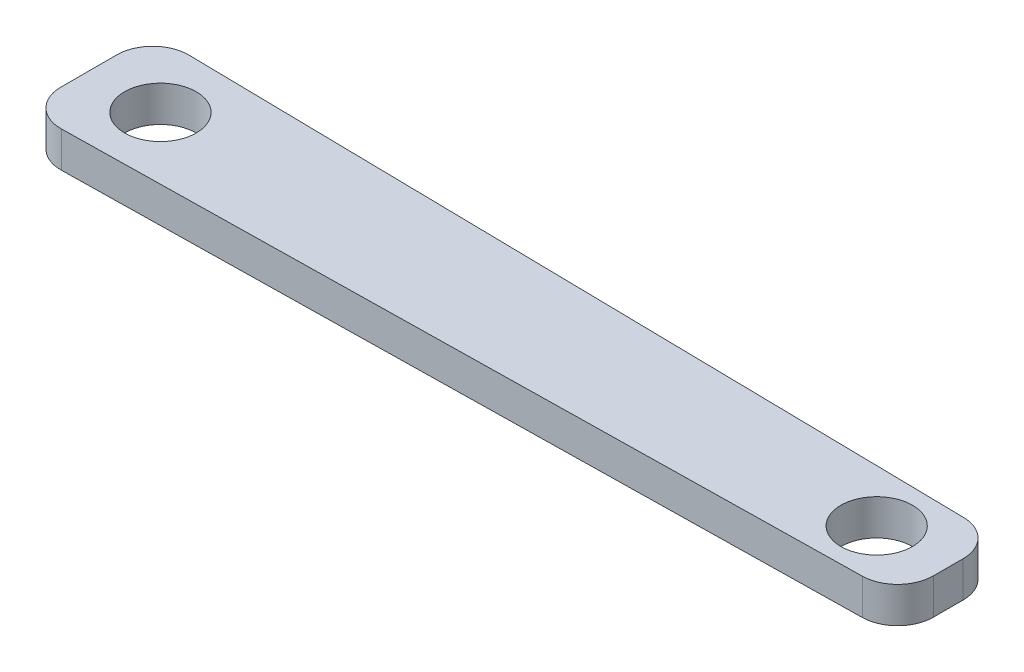
ISO-10303-21;
HEADER;
FILE_DESCRIPTION(('STEP AP214'),'2;1');
FILE_NAME('part.step','',(''),(''),'','','');
FILE_SCHEMA(('AUTOMOTIVE_DESIGN { 1 0 10303 214 1 1 1 1 }'));
ENDSEC;
DATA;
#1=APPLICATION_CONTEXT('core data for automotive mechanical design processes');
#2=APPLICATION_PROTOCOL_DEFINITION('international standard','automotive_design',2000,#1);
#3=PRODUCT_CONTEXT('',#1,'mechanical');
#4=PRODUCT('Part','Part','',(#3));
#5=PRODUCT_RELATED_PRODUCT_CATEGORY('part','',(#4));
#6=PRODUCT_DEFINITION_FORMATION('','',#4);
#7=PRODUCT_DEFINITION_CONTEXT('part definition',#1,'design');
#8=PRODUCT_DEFINITION('design','',#6,#7);
#9=PRODUCT_DEFINITION_SHAPE('','',#8);
#10=(LENGTH_UNIT() NAMED_UNIT(*) SI_UNIT(.MILLI.,.METRE.));
#11=(NAMED_UNIT(*) PLANE_ANGLE_UNIT() SI_UNIT($,.RADIAN.));
#12=(NAMED_UNIT(*) SI_UNIT($,.STERADIAN.) SOLID_ANGLE_UNIT());
#13=UNCERTAINTY_MEASURE_WITH_UNIT(LENGTH_MEASURE(1.E-05),#10,'distance_accuracy_value','');
#14=(GEOMETRIC_REPRESENTATION_CONTEXT(3) GLOBAL_UNCERTAINTY_ASSIGNED_CONTEXT((#13)) GLOBAL_UNIT_ASSIGNED_CONTEXT((#10,
#11,#12)) REPRESENTATION_CONTEXT('',''));
#15=CARTESIAN_POINT('',(0.,0.,0.));
#16=DIRECTION('',(0.,0.,1.));
#17=DIRECTION('',(1.,0.,0.));
#18=AXIS2_PLACEMENT_3D('',#15,#16,#17);
#19=CARTESIAN_POINT('',(0.,5.,0.));
#20=DIRECTION('',(0.,1.,0.));
#21=DIRECTION('',(0.,0.,1.));
#22=AXIS2_PLACEMENT_3D('',#19,#20,#21);
#23=PLANE('',#22);
#24=CARTESIAN_POINT('',(10.,5.,-9.00000000000004));
#25=DIRECTION('',(0.,1.,0.));
#26=DIRECTION('',(0.,0.,1.));
#27=AXIS2_PLACEMENT_3D('',#24,#25,#26);
#28=CIRCLE('',#27,5.);
#29=CARTESIAN_POINT('',(10.,5.,-4.00000000000004));
#30=VERTEX_POINT('',#29);
#31=EDGE_CURVE('E130',#30,#30,#28,.T.);
#32=ORIENTED_EDGE('',*,*,#31,.F.);
#33=EDGE_LOOP('',(#32));
#34=FACE_BOUND('',#33,.T.);
#35=DIRECTION('',(-0.999861140000245,0.,-0.0166643546952861));
#36=VECTOR('',#35,1.);
#37=CARTESIAN_POINT('',(119.999982992822,5.,-15.9999999999798));
#38=LINE('',#37,#36);
#39=CARTESIAN_POINT('',(115.083304766298,5.,-16.0819446487031));
#40=VERTEX_POINT('',#39);
#41=CARTESIAN_POINT('',(5.08332177347645,5.,-17.9152779584338));
#42=VERTEX_POINT('',#41);
#43=EDGE_CURVE('E139',#40,#42,#38,.T.);
#44=ORIENTED_EDGE('',*,*,#43,.T.);
#45=CARTESIAN_POINT('',(5.,5.,-12.9159722584326));
#46=DIRECTION('',(0.,1.,0.));
#47=DIRECTION('',(0.,0.,1.));
#48=AXIS2_PLACEMENT_3D('',#45,#46,#47);
#49=CIRCLE('',#48,5.);
#50=CARTESIAN_POINT('',(0.,5.,-12.9159722584326));
#51=VERTEX_POINT('',#50);
#52=EDGE_CURVE('E158',#42,#51,#49,.T.);
#53=ORIENTED_EDGE('',*,*,#52,.T.);
#54=DIRECTION('',(0.,0.,1.));
#55=VECTOR('',#54,1.);
#56=CARTESIAN_POINT('',(0.,5.,-18.));
#57=LINE('',#56,#55);
#58=CARTESIAN_POINT('',(0.,5.,-5.08402774156567));
#59=VERTEX_POINT('',#58);
#60=EDGE_CURVE('E122',#51,#59,#57,.T.);
#61=ORIENTED_EDGE('',*,*,#60,.T.);
#62=CARTESIAN_POINT('',(5.,5.,-5.08402774156567));
#63=DIRECTION('',(0.,1.,0.));
#64=DIRECTION('',(0.,0.,1.));
#65=AXIS2_PLACEMENT_3D('',#62,#63,#64);
#66=CIRCLE('',#65,5.);
#67=CARTESIAN_POINT('',(5.08332177347475,5.,-0.084722041564414));
#68=VERTEX_POINT('',#67);
#69=EDGE_CURVE('E153',#59,#68,#66,.T.);
#70=ORIENTED_EDGE('',*,*,#69,.T.);
#71=DIRECTION('',(0.999861140000251,0.,-0.0166643546949496));
#72=VECTOR('',#71,1.);
#73=CARTESIAN_POINT('',(0.,5.,0.));
#74=LINE('',#73,#72);
#75=CARTESIAN_POINT('',(115.083304766297,5.,-1.91805535125815));
#76=VERTEX_POINT('',#75);
#77=EDGE_CURVE('E169',#68,#76,#74,.T.);
#78=ORIENTED_EDGE('',*,*,#77,.T.);
#79=CARTESIAN_POINT('',(114.999982992822,5.,-6.9173610512594));
#80=DIRECTION('',(0.,1.,0.));
#81=DIRECTION('',(0.,0.,1.));
#82=AXIS2_PLACEMENT_3D('',#79,#80,#81);
#83=CIRCLE('',#82,5.);
#84=CARTESIAN_POINT('',(119.999982992822,5.,-6.91736105125941));
#85=VERTEX_POINT('',#84);
#86=EDGE_CURVE('E58',#76,#85,#83,.T.);
#87=ORIENTED_EDGE('',*,*,#86,.T.);
#88=DIRECTION('',(0.,0.,-1.));
#89=VECTOR('',#88,1.);
#90=CARTESIAN_POINT('',(119.999982992822,5.,-1.9999999999798));
#91=LINE('',#90,#89);
#92=CARTESIAN_POINT('',(119.999982992822,5.,-11.0826389487019));
#93=VERTEX_POINT('',#92);
#94=EDGE_CURVE('E177',#85,#93,#91,.T.);
#95=ORIENTED_EDGE('',*,*,#94,.T.);
#96=CARTESIAN_POINT('',(114.999982992822,5.,-11.0826389487019));
#97=DIRECTION('',(0.,1.,0.));
#98=DIRECTION('',(0.,0.,1.));
#99=AXIS2_PLACEMENT_3D('',#96,#97,#98);
#100=CIRCLE('',#99,5.);
#101=EDGE_CURVE('E156',#93,#40,#100,.T.);
#102=ORIENTED_EDGE('',*,*,#101,.T.);
#103=EDGE_LOOP('',(#44,#53,#61,#70,#78,#87,#95,#102));
#104=FACE_BOUND('',#103,.T.);
#105=CARTESIAN_POINT('',(110.,5.,-9.00000000000042));
#106=DIRECTION('',(0.,1.,0.));
#107=DIRECTION('',(0.,0.,1.));
#108=AXIS2_PLACEMENT_3D('',#105,#106,#107);
#109=CIRCLE('',#108,4.99999999999999);
#110=CARTESIAN_POINT('',(110.,5.,-4.00000000000043));
#111=VERTEX_POINT('',#110);
#112=EDGE_CURVE('E184',#111,#111,#109,.T.);
#113=ORIENTED_EDGE('',*,*,#112,.F.);
#114=EDGE_LOOP('',(#113));
#115=FACE_BOUND('',#114,.T.);
#116=ADVANCED_FACE('F36',(#34,#104,#115),#23,.T.);
#117=CARTESIAN_POINT('',(0.,0.,0.));
#118=DIRECTION('',(0.,1.,0.));
#119=DIRECTION('',(0.,0.,1.));
#120=AXIS2_PLACEMENT_3D('',#117,#118,#119);
#121=PLANE('',#120);
#122=CARTESIAN_POINT('',(10.,0.,-9.00000000000004));
#123=DIRECTION('',(0.,1.,0.));
#124=DIRECTION('',(0.,0.,1.));
#125=AXIS2_PLACEMENT_3D('',#122,#123,#124);
#126=CIRCLE('',#125,5.);
#127=CARTESIAN_POINT('',(10.,0.,-4.00000000000004));
#128=VERTEX_POINT('',#127);
#129=EDGE_CURVE('E136',#128,#128,#126,.T.);
#130=ORIENTED_EDGE('',*,*,#129,.T.);
#131=EDGE_LOOP('',(#130));
#132=FACE_BOUND('',#131,.T.);
#133=DIRECTION('',(0.,0.,1.));
#134=VECTOR('',#133,1.);
#135=CARTESIAN_POINT('',(0.,0.,-18.));
#136=LINE('',#135,#134);
#137=CARTESIAN_POINT('',(0.,0.,-12.9159722584326));
#138=VERTEX_POINT('',#137);
#139=CARTESIAN_POINT('',(0.,0.,-5.08402774156567));
#140=VERTEX_POINT('',#139);
#141=EDGE_CURVE('E119',#138,#140,#136,.T.);
#142=ORIENTED_EDGE('',*,*,#141,.F.);
#143=CARTESIAN_POINT('',(5.,0.,-12.9159722584326));
#144=DIRECTION('',(0.,1.,0.));
#145=DIRECTION('',(0.,0.,1.));
#146=AXIS2_PLACEMENT_3D('',#143,#144,#145);
#147=CIRCLE('',#146,5.);
#148=CARTESIAN_POINT('',(5.08332177347645,0.,-17.9152779584338));
#149=VERTEX_POINT('',#148);
#150=EDGE_CURVE('E102',#138,#149,#147,.F.);
#151=ORIENTED_EDGE('',*,*,#150,.T.);
#152=DIRECTION('',(-0.999861140000245,0.,-0.0166643546952861));
#153=VECTOR('',#152,1.);
#154=CARTESIAN_POINT('',(119.999982992822,0.,-15.9999999999798));
#155=LINE('',#154,#153);
#156=CARTESIAN_POINT('',(115.083304766298,0.,-16.0819446487031));
#157=VERTEX_POINT('',#156);
#158=EDGE_CURVE('E143',#157,#149,#155,.T.);
#159=ORIENTED_EDGE('',*,*,#158,.F.);
#160=CARTESIAN_POINT('',(114.999982992822,0.,-11.0826389487019));
#161=DIRECTION('',(0.,1.,0.));
#162=DIRECTION('',(0.,0.,1.));
#163=AXIS2_PLACEMENT_3D('',#160,#161,#162);
#164=CIRCLE('',#163,5.);
#165=CARTESIAN_POINT('',(119.999982992822,0.,-11.0826389487019));
#166=VERTEX_POINT('',#165);
#167=EDGE_CURVE('E113',#157,#166,#164,.F.);
#168=ORIENTED_EDGE('',*,*,#167,.T.);
#169=DIRECTION('',(0.,0.,-1.));
#170=VECTOR('',#169,1.);
#171=CARTESIAN_POINT('',(119.999982992822,0.,-1.9999999999798));
#172=LINE('',#171,#170);
#173=CARTESIAN_POINT('',(119.999982992822,0.,-6.91736105125941));
#174=VERTEX_POINT('',#173);
#175=EDGE_CURVE('E133',#174,#166,#172,.T.);
#176=ORIENTED_EDGE('',*,*,#175,.F.);
#177=CARTESIAN_POINT('',(114.999982992822,0.,-6.9173610512594));
#178=DIRECTION('',(0.,1.,0.));
#179=DIRECTION('',(0.,0.,1.));
#180=AXIS2_PLACEMENT_3D('',#177,#178,#179);
#181=CIRCLE('',#180,5.);
#182=CARTESIAN_POINT('',(115.083304766297,0.,-1.91805535125815));
#183=VERTEX_POINT('',#182);
#184=EDGE_CURVE('E147',#174,#183,#181,.F.);
#185=ORIENTED_EDGE('',*,*,#184,.T.);
#186=DIRECTION('',(0.999861140000251,0.,-0.0166643546949496));
#187=VECTOR('',#186,1.);
#188=CARTESIAN_POINT('',(0.,0.,0.));
#189=LINE('',#188,#187);
#190=CARTESIAN_POINT('',(5.08332177347475,0.,-0.084722041564414));
#191=VERTEX_POINT('',#190);
#192=EDGE_CURVE('E129',#191,#183,#189,.T.);
#193=ORIENTED_EDGE('',*,*,#192,.F.);
#194=CARTESIAN_POINT('',(5.,0.,-5.08402774156567));
#195=DIRECTION('',(0.,1.,0.));
#196=DIRECTION('',(0.,0.,1.));
#197=AXIS2_PLACEMENT_3D('',#194,#195,#196);
#198=CIRCLE('',#197,5.);
#199=EDGE_CURVE('E123',#191,#140,#198,.F.);
#200=ORIENTED_EDGE('',*,*,#199,.T.);
#201=EDGE_LOOP('',(#142,#151,#159,#168,#176,#185,#193,#200));
#202=FACE_BOUND('',#201,.T.);
#203=CARTESIAN_POINT('',(110.,0.,-9.00000000000042));
#204=DIRECTION('',(0.,1.,0.));
#205=DIRECTION('',(0.,0.,1.));
#206=AXIS2_PLACEMENT_3D('',#203,#204,#205);
#207=CIRCLE('',#206,4.99999999999999);
#208=CARTESIAN_POINT('',(110.,0.,-4.00000000000043));
#209=VERTEX_POINT('',#208);
#210=EDGE_CURVE('E186',#209,#209,#207,.T.);
#211=ORIENTED_EDGE('',*,*,#210,.T.);
#212=EDGE_LOOP('',(#211));
#213=FACE_BOUND('',#212,.T.);
#214=ADVANCED_FACE('F126',(#132,#202,#213),#121,.F.);
#215=CARTESIAN_POINT('',(0.,5.,-18.));
#216=DIRECTION('',(1.,0.,0.));
#217=DIRECTION('',(0.,0.,-1.));
#218=AXIS2_PLACEMENT_3D('',#215,#216,#217);
#219=PLANE('',#218);
#220=ORIENTED_EDGE('',*,*,#60,.F.);
#221=DIRECTION('',(0.,-1.,0.));
#222=VECTOR('',#221,1.);
#223=CARTESIAN_POINT('',(0.,5.,-12.9159722584326));
#224=LINE('',#223,#222);
#225=EDGE_CURVE('E106',#51,#138,#224,.T.);
#226=ORIENTED_EDGE('',*,*,#225,.T.);
#227=ORIENTED_EDGE('',*,*,#141,.T.);
#228=DIRECTION('',(0.,-1.,0.));
#229=VECTOR('',#228,1.);
#230=CARTESIAN_POINT('',(0.,5.,-5.08402774156567));
#231=LINE('',#230,#229);
#232=EDGE_CURVE('E124',#140,#59,#231,.F.);
#233=ORIENTED_EDGE('',*,*,#232,.T.);
#234=EDGE_LOOP('',(#220,#226,#227,#233));
#235=FACE_BOUND('',#234,.T.);
#236=ADVANCED_FACE('F118',(#235),#219,.F.);
#237=CARTESIAN_POINT('',(0.,5.,0.));
#238=DIRECTION('',(-0.0166643546949496,0.,-0.999861140000251));
#239=DIRECTION('',(-0.999861140000251,0.,0.0166643546949496));
#240=AXIS2_PLACEMENT_3D('',#237,#238,#239);
#241=PLANE('',#240);
#242=ORIENTED_EDGE('',*,*,#192,.T.);
#243=DIRECTION('',(0.,-1.,0.));
#244=VECTOR('',#243,1.);
#245=CARTESIAN_POINT('',(115.083304766297,5.,-1.91805535125815));
#246=LINE('',#245,#244);
#247=EDGE_CURVE('E11',#183,#76,#246,.F.);
#248=ORIENTED_EDGE('',*,*,#247,.T.);
#249=ORIENTED_EDGE('',*,*,#77,.F.);
#250=DIRECTION('',(0.,-1.,0.));
#251=VECTOR('',#250,1.);
#252=CARTESIAN_POINT('',(5.08332177347475,5.,-0.084722041564414));
#253=LINE('',#252,#251);
#254=EDGE_CURVE('E44',#68,#191,#253,.T.);
#255=ORIENTED_EDGE('',*,*,#254,.T.);
#256=EDGE_LOOP('',(#242,#248,#249,#255));
#257=FACE_BOUND('',#256,.T.);
#258=ADVANCED_FACE('F167',(#257),#241,.F.);
#259=CARTESIAN_POINT('',(119.999982992822,5.,-1.9999999999798));
#260=DIRECTION('',(-1.,0.,0.));
#261=DIRECTION('',(0.,0.,1.));
#262=AXIS2_PLACEMENT_3D('',#259,#260,#261);
#263=PLANE('',#262);
#264=ORIENTED_EDGE('',*,*,#175,.T.);
#265=DIRECTION('',(0.,-1.,0.));
#266=VECTOR('',#265,1.);
#267=CARTESIAN_POINT('',(119.999982992822,5.,-11.0826389487019));
#268=LINE('',#267,#266);
#269=EDGE_CURVE('E51',#166,#93,#268,.F.);
#270=ORIENTED_EDGE('',*,*,#269,.T.);
#271=ORIENTED_EDGE('',*,*,#94,.F.);
#272=DIRECTION('',(0.,-1.,0.));
#273=VECTOR('',#272,1.);
#274=CARTESIAN_POINT('',(119.999982992822,5.,-6.91736105125941));
#275=LINE('',#274,#273);
#276=EDGE_CURVE('E160',#85,#174,#275,.T.);
#277=ORIENTED_EDGE('',*,*,#276,.T.);
#278=EDGE_LOOP('',(#264,#270,#271,#277));
#279=FACE_BOUND('',#278,.T.);
#280=ADVANCED_FACE('F176',(#279),#263,.F.);
#281=CARTESIAN_POINT('',(119.999982992822,5.,-15.9999999999798));
#282=DIRECTION('',(-0.0166643546952861,0.,0.999861140000245));
#283=DIRECTION('',(0.999861140000245,0.,0.0166643546952861));
#284=AXIS2_PLACEMENT_3D('',#281,#282,#283);
#285=PLANE('',#284);
#286=ORIENTED_EDGE('',*,*,#158,.T.);
#287=DIRECTION('',(0.,-1.,0.));
#288=VECTOR('',#287,1.);
#289=CARTESIAN_POINT('',(5.08332177347645,5.,-17.9152779584338));
#290=LINE('',#289,#288);
#291=EDGE_CURVE('E107',#149,#42,#290,.F.);
#292=ORIENTED_EDGE('',*,*,#291,.T.);
#293=ORIENTED_EDGE('',*,*,#43,.F.);
#294=DIRECTION('',(0.,-1.,0.));
#295=VECTOR('',#294,1.);
#296=CARTESIAN_POINT('',(115.083304766298,5.,-16.0819446487031));
#297=LINE('',#296,#295);
#298=EDGE_CURVE('E112',#40,#157,#297,.T.);
#299=ORIENTED_EDGE('',*,*,#298,.T.);
#300=EDGE_LOOP('',(#286,#292,#293,#299));
#301=FACE_BOUND('',#300,.T.);
#302=ADVANCED_FACE('F208',(#301),#285,.F.);
#303=CARTESIAN_POINT('',(10.,5.,-9.00000000000004));
#304=DIRECTION('',(0.,-1.,0.));
#305=DIRECTION('',(0.,0.,-1.));
#306=AXIS2_PLACEMENT_3D('',#303,#304,#305);
#307=CYLINDRICAL_SURFACE('',#306,5.);
#308=ORIENTED_EDGE('',*,*,#31,.T.);
#309=EDGE_LOOP('',(#308));
#310=FACE_BOUND('',#309,.T.);
#311=ORIENTED_EDGE('',*,*,#129,.F.);
#312=EDGE_LOOP('',(#311));
#313=FACE_BOUND('',#312,.T.);
#314=ADVANCED_FACE('F205',(#310,#313),#307,.F.);
#315=CARTESIAN_POINT('',(110.,5.,-9.00000000000042));
#316=DIRECTION('',(0.,-1.,0.));
#317=DIRECTION('',(0.,0.,-1.));
#318=AXIS2_PLACEMENT_3D('',#315,#316,#317);
#319=CYLINDRICAL_SURFACE('',#318,4.99999999999999);
#320=ORIENTED_EDGE('',*,*,#112,.T.);
#321=EDGE_LOOP('',(#320));
#322=FACE_BOUND('',#321,.T.);
#323=ORIENTED_EDGE('',*,*,#210,.F.);
#324=EDGE_LOOP('',(#323));
#325=FACE_BOUND('',#324,.T.);
#326=ADVANCED_FACE('F192',(#322,#325),#319,.F.);
#327=CARTESIAN_POINT('',(5.,5.,-12.9159722584326));
#328=DIRECTION('',(0.,-1.,0.));
#329=DIRECTION('',(0.,0.,-1.));
#330=AXIS2_PLACEMENT_3D('',#327,#328,#329);
#331=CYLINDRICAL_SURFACE('',#330,5.);
#332=ORIENTED_EDGE('',*,*,#52,.F.);
#333=ORIENTED_EDGE('',*,*,#291,.F.);
#334=ORIENTED_EDGE('',*,*,#150,.F.);
#335=ORIENTED_EDGE('',*,*,#225,.F.);
#336=EDGE_LOOP('',(#332,#333,#334,#335));
#337=FACE_BOUND('',#336,.T.);
#338=ADVANCED_FACE('F105',(#337),#331,.T.);
#339=CARTESIAN_POINT('',(114.999982992822,5.,-11.0826389487019));
#340=DIRECTION('',(0.,-1.,0.));
#341=DIRECTION('',(0.,0.,-1.));
#342=AXIS2_PLACEMENT_3D('',#339,#340,#341);
#343=CYLINDRICAL_SURFACE('',#342,5.);
#344=ORIENTED_EDGE('',*,*,#101,.F.);
#345=ORIENTED_EDGE('',*,*,#269,.F.);
#346=ORIENTED_EDGE('',*,*,#167,.F.);
#347=ORIENTED_EDGE('',*,*,#298,.F.);
#348=EDGE_LOOP('',(#344,#345,#346,#347));
#349=FACE_BOUND('',#348,.T.);
#350=ADVANCED_FACE('F220',(#349),#343,.T.);
#351=CARTESIAN_POINT('',(114.999982992822,5.,-6.9173610512594));
#352=DIRECTION('',(0.,-1.,0.));
#353=DIRECTION('',(0.,0.,-1.));
#354=AXIS2_PLACEMENT_3D('',#351,#352,#353);
#355=CYLINDRICAL_SURFACE('',#354,5.);
#356=ORIENTED_EDGE('',*,*,#86,.F.);
#357=ORIENTED_EDGE('',*,*,#247,.F.);
#358=ORIENTED_EDGE('',*,*,#184,.F.);
#359=ORIENTED_EDGE('',*,*,#276,.F.);
#360=EDGE_LOOP('',(#356,#357,#358,#359));
#361=FACE_BOUND('',#360,.T.);
#362=ADVANCED_FACE('F175',(#361),#355,.T.);
#363=CARTESIAN_POINT('',(5.,5.,-5.08402774156567));
#364=DIRECTION('',(0.,-1.,0.));
#365=DIRECTION('',(0.,0.,-1.));
#366=AXIS2_PLACEMENT_3D('',#363,#364,#365);
#367=CYLINDRICAL_SURFACE('',#366,5.);
#368=ORIENTED_EDGE('',*,*,#69,.F.);
#369=ORIENTED_EDGE('',*,*,#232,.F.);
#370=ORIENTED_EDGE('',*,*,#199,.F.);
#371=ORIENTED_EDGE('',*,*,#254,.F.);
#372=EDGE_LOOP('',(#368,#369,#370,#371));
#373=FACE_BOUND('',#372,.T.);
#374=ADVANCED_FACE('F38',(#373),#367,.T.);
#375=CLOSED_SHELL('',(#116,#214,#236,#258,#280,#302,#314,#326,#338,#350,#362,#374));
#376=MANIFOLD_SOLID_BREP('B2',#375);
#377=ADVANCED_BREP_SHAPE_REPRESENTATION('',(#18,#376),#14);
#378=SHAPE_DEFINITION_REPRESENTATION(#9,#377);
ENDSEC;
END-ISO-10303-21;
